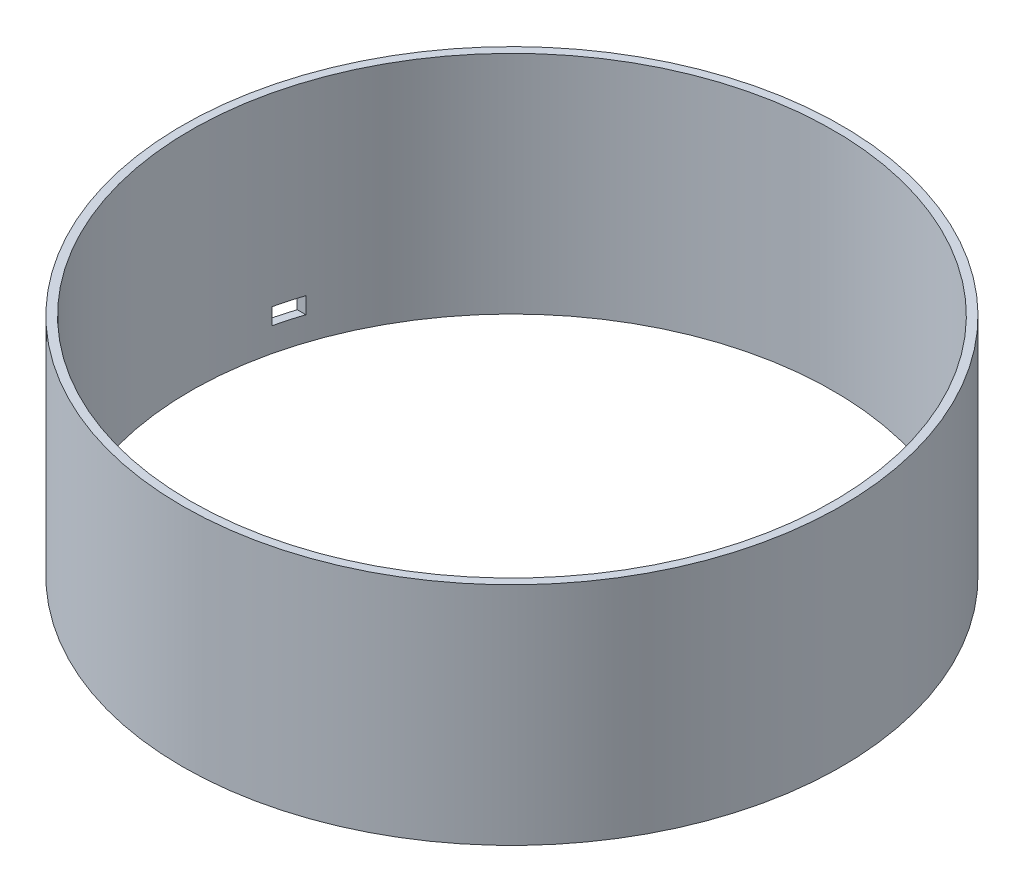
ISO-10303-21;
HEADER;
FILE_DESCRIPTION(('STEP AP214'),'2;1');
FILE_NAME('part.step','',(''),(''),'','','');
FILE_SCHEMA(('AUTOMOTIVE_DESIGN { 1 0 10303 214 1 1 1 1 }'));
ENDSEC;
DATA;
#1=APPLICATION_CONTEXT('core data for automotive mechanical design processes');
#2=APPLICATION_PROTOCOL_DEFINITION('international standard','automotive_design',2000,#1);
#3=PRODUCT_CONTEXT('',#1,'mechanical');
#4=PRODUCT('Part','Part','',(#3));
#5=PRODUCT_RELATED_PRODUCT_CATEGORY('part','',(#4));
#6=PRODUCT_DEFINITION_FORMATION('','',#4);
#7=PRODUCT_DEFINITION_CONTEXT('part definition',#1,'design');
#8=PRODUCT_DEFINITION('design','',#6,#7);
#9=PRODUCT_DEFINITION_SHAPE('','',#8);
#10=(LENGTH_UNIT() NAMED_UNIT(*) SI_UNIT(.MILLI.,.METRE.));
#11=(NAMED_UNIT(*) PLANE_ANGLE_UNIT() SI_UNIT($,.RADIAN.));
#12=(NAMED_UNIT(*) SI_UNIT($,.STERADIAN.) SOLID_ANGLE_UNIT());
#13=UNCERTAINTY_MEASURE_WITH_UNIT(LENGTH_MEASURE(1.E-05),#10,'distance_accuracy_value','');
#14=(GEOMETRIC_REPRESENTATION_CONTEXT(3) GLOBAL_UNCERTAINTY_ASSIGNED_CONTEXT((#13)) GLOBAL_UNIT_ASSIGNED_CONTEXT((#10,
#11,#12)) REPRESENTATION_CONTEXT('',''));
#15=CARTESIAN_POINT('',(0.,0.,0.));
#16=DIRECTION('',(0.,0.,1.));
#17=DIRECTION('',(1.,0.,0.));
#18=AXIS2_PLACEMENT_3D('',#15,#16,#17);
#19=CARTESIAN_POINT('',(0.,137.,0.));
#20=DIRECTION('',(0.,1.,0.));
#21=DIRECTION('',(0.,0.,1.));
#22=AXIS2_PLACEMENT_3D('',#19,#20,#21);
#23=PLANE('',#22);
#24=CARTESIAN_POINT('',(0.,137.,0.));
#25=DIRECTION('',(0.,1.,0.));
#26=DIRECTION('',(0.,0.,1.));
#27=AXIS2_PLACEMENT_3D('',#24,#25,#26);
#28=CIRCLE('',#27,200.);
#29=CARTESIAN_POINT('',(0.,137.,200.));
#30=VERTEX_POINT('',#29);
#31=EDGE_CURVE('E100',#30,#30,#28,.T.);
#32=ORIENTED_EDGE('',*,*,#31,.T.);
#33=EDGE_LOOP('',(#32));
#34=FACE_BOUND('',#33,.T.);
#35=CARTESIAN_POINT('',(0.,137.,0.));
#36=DIRECTION('',(0.,1.,0.));
#37=DIRECTION('',(0.,0.,1.));
#38=AXIS2_PLACEMENT_3D('',#35,#36,#37);
#39=CIRCLE('',#38,195.);
#40=CARTESIAN_POINT('',(0.,137.,195.));
#41=VERTEX_POINT('',#40);
#42=EDGE_CURVE('E92',#41,#41,#39,.T.);
#43=ORIENTED_EDGE('',*,*,#42,.F.);
#44=EDGE_LOOP('',(#43));
#45=FACE_BOUND('',#44,.T.);
#46=ADVANCED_FACE('F33',(#34,#45),#23,.T.);
#47=CARTESIAN_POINT('',(0.,0.,0.));
#48=DIRECTION('',(0.,1.,0.));
#49=DIRECTION('',(0.,0.,1.));
#50=AXIS2_PLACEMENT_3D('',#47,#48,#49);
#51=PLANE('',#50);
#52=CARTESIAN_POINT('',(0.,0.,0.));
#53=DIRECTION('',(0.,1.,0.));
#54=DIRECTION('',(0.,0.,1.));
#55=AXIS2_PLACEMENT_3D('',#52,#53,#54);
#56=CIRCLE('',#55,200.);
#57=CARTESIAN_POINT('',(0.,0.,200.));
#58=VERTEX_POINT('',#57);
#59=EDGE_CURVE('E98',#58,#58,#56,.T.);
#60=ORIENTED_EDGE('',*,*,#59,.F.);
#61=EDGE_LOOP('',(#60));
#62=FACE_BOUND('',#61,.T.);
#63=CARTESIAN_POINT('',(0.,0.,0.));
#64=DIRECTION('',(0.,1.,0.));
#65=DIRECTION('',(0.,0.,1.));
#66=AXIS2_PLACEMENT_3D('',#63,#64,#65);
#67=CIRCLE('',#66,195.);
#68=CARTESIAN_POINT('',(0.,0.,195.));
#69=VERTEX_POINT('',#68);
#70=EDGE_CURVE('E89',#69,#69,#67,.T.);
#71=ORIENTED_EDGE('',*,*,#70,.T.);
#72=EDGE_LOOP('',(#71));
#73=FACE_BOUND('',#72,.T.);
#74=ADVANCED_FACE('F132',(#62,#73),#51,.F.);
#75=CARTESIAN_POINT('',(0.,137.,0.));
#76=DIRECTION('',(0.,-1.,0.));
#77=DIRECTION('',(0.,0.,-1.));
#78=AXIS2_PLACEMENT_3D('',#75,#76,#77);
#79=CYLINDRICAL_SURFACE('',#78,200.);
#80=CARTESIAN_POINT('',(0.,24.6210437795372,0.));
#81=DIRECTION('',(0.,1.,0.));
#82=DIRECTION('',(0.,0.,1.));
#83=AXIS2_PLACEMENT_3D('',#80,#81,#82);
#84=CIRCLE('',#83,200.);
#85=CARTESIAN_POINT('',(-190.668503574178,24.6210437795372,-60.3781561890024));
#86=VERTEX_POINT('',#85);
#87=CARTESIAN_POINT('',(-195.014305252883,24.6210437795372,-44.3781561890024));
#88=VERTEX_POINT('',#87);
#89=EDGE_CURVE('E88',#86,#88,#84,.T.);
#90=ORIENTED_EDGE('',*,*,#89,.T.);
#91=DIRECTION('',(0.,-1.,0.));
#92=VECTOR('',#91,1.);
#93=CARTESIAN_POINT('',(-195.014305252883,137.,-44.3781561890023));
#94=LINE('',#93,#92);
#95=CARTESIAN_POINT('',(-195.014305252883,14.6210437795372,-44.3781561890024));
#96=VERTEX_POINT('',#95);
#97=EDGE_CURVE('E81',#88,#96,#94,.T.);
#98=ORIENTED_EDGE('',*,*,#97,.T.);
#99=CARTESIAN_POINT('',(0.,14.6210437795372,0.));
#100=DIRECTION('',(0.,-1.,0.));
#101=DIRECTION('',(0.,0.,-1.));
#102=AXIS2_PLACEMENT_3D('',#99,#100,#101);
#103=CIRCLE('',#102,200.);
#104=CARTESIAN_POINT('',(-190.668503574178,14.6210437795372,-60.3781561890024));
#105=VERTEX_POINT('',#104);
#106=EDGE_CURVE('E70',#96,#105,#103,.T.);
#107=ORIENTED_EDGE('',*,*,#106,.T.);
#108=DIRECTION('',(0.,-1.,0.));
#109=VECTOR('',#108,1.);
#110=CARTESIAN_POINT('',(-190.668503574178,137.,-60.3781561890025));
#111=LINE('',#110,#109);
#112=EDGE_CURVE('E75',#105,#86,#111,.F.);
#113=ORIENTED_EDGE('',*,*,#112,.T.);
#114=EDGE_LOOP('',(#90,#98,#107,#113));
#115=FACE_BOUND('',#114,.T.);
#116=ORIENTED_EDGE('',*,*,#31,.F.);
#117=EDGE_LOOP('',(#116));
#118=FACE_BOUND('',#117,.T.);
#119=ORIENTED_EDGE('',*,*,#59,.T.);
#120=EDGE_LOOP('',(#119));
#121=FACE_BOUND('',#120,.T.);
#122=ADVANCED_FACE('F35',(#115,#118,#121),#79,.T.);
#123=CARTESIAN_POINT('',(0.,137.,0.));
#124=DIRECTION('',(0.,-1.,0.));
#125=DIRECTION('',(0.,0.,-1.));
#126=AXIS2_PLACEMENT_3D('',#123,#124,#125);
#127=CYLINDRICAL_SURFACE('',#126,195.);
#128=DIRECTION('',(0.,-1.,0.));
#129=VECTOR('',#128,1.);
#130=CARTESIAN_POINT('',(-189.883067315821,137.,-44.3781561890023));
#131=LINE('',#130,#129);
#132=CARTESIAN_POINT('',(-189.883067315821,24.6210437795372,-44.3781561890024));
#133=VERTEX_POINT('',#132);
#134=CARTESIAN_POINT('',(-189.883067315821,14.6210437795372,-44.3781561890024));
#135=VERTEX_POINT('',#134);
#136=EDGE_CURVE('E11',#133,#135,#131,.T.);
#137=ORIENTED_EDGE('',*,*,#136,.F.);
#138=CARTESIAN_POINT('',(0.,24.6210437795372,0.));
#139=DIRECTION('',(0.,1.,0.));
#140=DIRECTION('',(0.,0.,1.));
#141=AXIS2_PLACEMENT_3D('',#138,#139,#140);
#142=CIRCLE('',#141,195.);
#143=CARTESIAN_POINT('',(-185.417038740285,24.6210437795372,-60.3781561890024));
#144=VERTEX_POINT('',#143);
#145=EDGE_CURVE('E41',#144,#133,#142,.T.);
#146=ORIENTED_EDGE('',*,*,#145,.F.);
#147=DIRECTION('',(0.,-1.,0.));
#148=VECTOR('',#147,1.);
#149=CARTESIAN_POINT('',(-185.417038740285,137.,-60.3781561890025));
#150=LINE('',#149,#148);
#151=CARTESIAN_POINT('',(-185.417038740285,14.6210437795372,-60.3781561890024));
#152=VERTEX_POINT('',#151);
#153=EDGE_CURVE('E107',#152,#144,#150,.F.);
#154=ORIENTED_EDGE('',*,*,#153,.F.);
#155=CARTESIAN_POINT('',(0.,14.6210437795372,0.));
#156=DIRECTION('',(0.,-1.,0.));
#157=DIRECTION('',(0.,0.,-1.));
#158=AXIS2_PLACEMENT_3D('',#155,#156,#157);
#159=CIRCLE('',#158,195.);
#160=EDGE_CURVE('E103',#135,#152,#159,.T.);
#161=ORIENTED_EDGE('',*,*,#160,.F.);
#162=EDGE_LOOP('',(#137,#146,#154,#161));
#163=FACE_BOUND('',#162,.T.);
#164=ORIENTED_EDGE('',*,*,#42,.T.);
#165=EDGE_LOOP('',(#164));
#166=FACE_BOUND('',#165,.T.);
#167=ORIENTED_EDGE('',*,*,#70,.F.);
#168=EDGE_LOOP('',(#167));
#169=FACE_BOUND('',#168,.T.);
#170=ADVANCED_FACE('F117',(#163,#166,#169),#127,.F.);
#171=CARTESIAN_POINT('',(-270.5,14.6210437795372,-44.3781561890024));
#172=DIRECTION('',(0.,0.,1.));
#173=DIRECTION('',(0.,-1.,0.));
#174=AXIS2_PLACEMENT_3D('',#171,#172,#173);
#175=PLANE('',#174);
#176=DIRECTION('',(1.,0.,0.));
#177=VECTOR('',#176,1.);
#178=CARTESIAN_POINT('',(-270.5,24.6210437795372,-44.3781561890024));
#179=LINE('',#178,#177);
#180=EDGE_CURVE('E76',#88,#133,#179,.T.);
#181=ORIENTED_EDGE('',*,*,#180,.T.);
#182=ORIENTED_EDGE('',*,*,#136,.T.);
#183=DIRECTION('',(1.,0.,0.));
#184=VECTOR('',#183,1.);
#185=CARTESIAN_POINT('',(-270.5,14.6210437795372,-44.3781561890024));
#186=LINE('',#185,#184);
#187=EDGE_CURVE('E53',#96,#135,#186,.T.);
#188=ORIENTED_EDGE('',*,*,#187,.F.);
#189=ORIENTED_EDGE('',*,*,#97,.F.);
#190=EDGE_LOOP('',(#181,#182,#188,#189));
#191=FACE_BOUND('',#190,.T.);
#192=ADVANCED_FACE('F80',(#191),#175,.F.);
#193=CARTESIAN_POINT('',(-270.5,24.6210437795372,-44.3781561890024));
#194=DIRECTION('',(0.,1.,0.));
#195=DIRECTION('',(0.,0.,1.));
#196=AXIS2_PLACEMENT_3D('',#193,#194,#195);
#197=PLANE('',#196);
#198=DIRECTION('',(1.,0.,0.));
#199=VECTOR('',#198,1.);
#200=CARTESIAN_POINT('',(-270.5,24.6210437795372,-60.3781561890024));
#201=LINE('',#200,#199);
#202=EDGE_CURVE('E113',#86,#144,#201,.T.);
#203=ORIENTED_EDGE('',*,*,#202,.T.);
#204=ORIENTED_EDGE('',*,*,#145,.T.);
#205=ORIENTED_EDGE('',*,*,#180,.F.);
#206=ORIENTED_EDGE('',*,*,#89,.F.);
#207=EDGE_LOOP('',(#203,#204,#205,#206));
#208=FACE_BOUND('',#207,.T.);
#209=ADVANCED_FACE('F111',(#208),#197,.F.);
#210=CARTESIAN_POINT('',(-270.5,14.6210437795372,-60.3781561890024));
#211=DIRECTION('',(0.,0.,-1.));
#212=DIRECTION('',(0.,1.,0.));
#213=AXIS2_PLACEMENT_3D('',#210,#211,#212);
#214=PLANE('',#213);
#215=DIRECTION('',(1.,0.,0.));
#216=VECTOR('',#215,1.);
#217=CARTESIAN_POINT('',(-270.5,14.6210437795372,-60.3781561890024));
#218=LINE('',#217,#216);
#219=EDGE_CURVE('E48',#105,#152,#218,.T.);
#220=ORIENTED_EDGE('',*,*,#219,.T.);
#221=ORIENTED_EDGE('',*,*,#153,.T.);
#222=ORIENTED_EDGE('',*,*,#202,.F.);
#223=ORIENTED_EDGE('',*,*,#112,.F.);
#224=EDGE_LOOP('',(#220,#221,#222,#223));
#225=FACE_BOUND('',#224,.T.);
#226=ADVANCED_FACE('F120',(#225),#214,.F.);
#227=CARTESIAN_POINT('',(-270.5,14.6210437795372,-44.3781561890024));
#228=DIRECTION('',(0.,-1.,0.));
#229=DIRECTION('',(0.,0.,-1.));
#230=AXIS2_PLACEMENT_3D('',#227,#228,#229);
#231=PLANE('',#230);
#232=ORIENTED_EDGE('',*,*,#187,.T.);
#233=ORIENTED_EDGE('',*,*,#160,.T.);
#234=ORIENTED_EDGE('',*,*,#219,.F.);
#235=ORIENTED_EDGE('',*,*,#106,.F.);
#236=EDGE_LOOP('',(#232,#233,#234,#235));
#237=FACE_BOUND('',#236,.T.);
#238=ADVANCED_FACE('F71',(#237),#231,.F.);
#239=CLOSED_SHELL('',(#46,#74,#122,#170,#192,#209,#226,#238));
#240=MANIFOLD_SOLID_BREP('B2',#239);
#241=ADVANCED_BREP_SHAPE_REPRESENTATION('',(#18,#240),#14);
#242=SHAPE_DEFINITION_REPRESENTATION(#9,#241);
ENDSEC;
END-ISO-10303-21;
